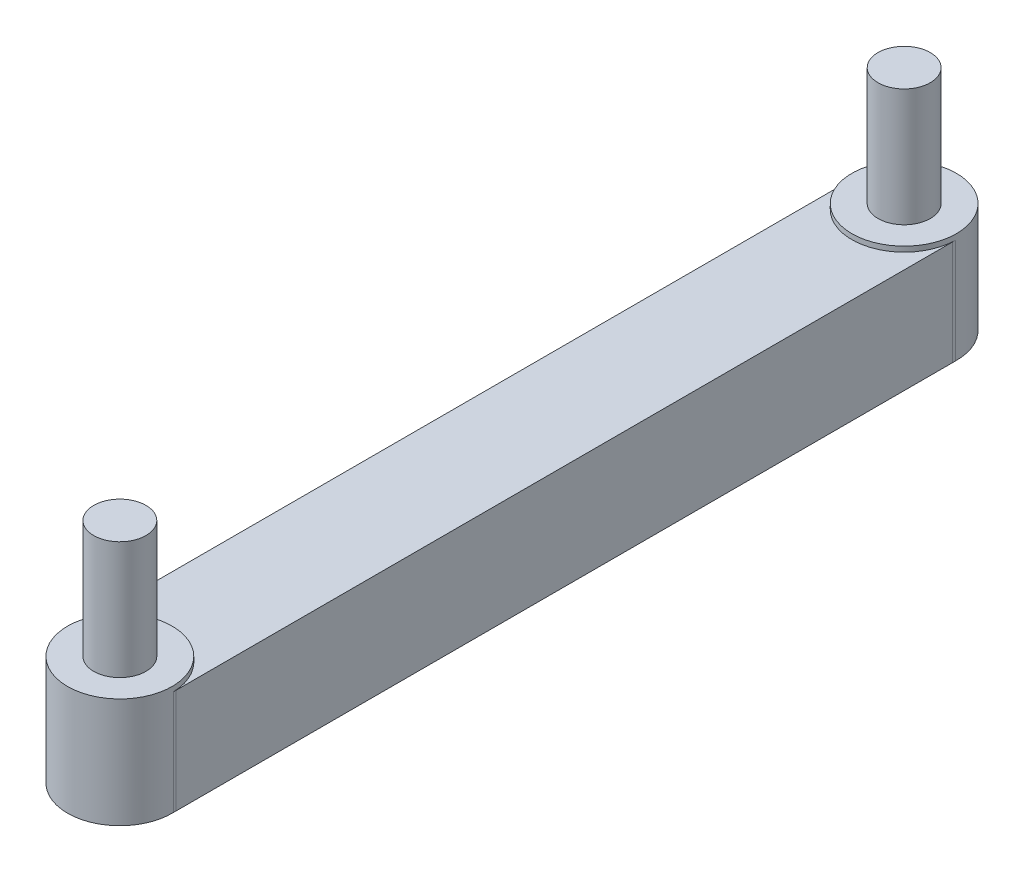
ISO-10303-21;
HEADER;
FILE_DESCRIPTION(('STEP AP214'),'2;1');
FILE_NAME('part.step','',(''),(''),'','','');
FILE_SCHEMA(('AUTOMOTIVE_DESIGN { 1 0 10303 214 1 1 1 1 }'));
ENDSEC;
DATA;
#1=APPLICATION_CONTEXT('core data for automotive mechanical design processes');
#2=APPLICATION_PROTOCOL_DEFINITION('international standard','automotive_design',2000,#1);
#3=PRODUCT_CONTEXT('',#1,'mechanical');
#4=PRODUCT('Part','Part','',(#3));
#5=PRODUCT_RELATED_PRODUCT_CATEGORY('part','',(#4));
#6=PRODUCT_DEFINITION_FORMATION('','',#4);
#7=PRODUCT_DEFINITION_CONTEXT('part definition',#1,'design');
#8=PRODUCT_DEFINITION('design','',#6,#7);
#9=PRODUCT_DEFINITION_SHAPE('','',#8);
#10=(LENGTH_UNIT() NAMED_UNIT(*) SI_UNIT(.MILLI.,.METRE.));
#11=(NAMED_UNIT(*) PLANE_ANGLE_UNIT() SI_UNIT($,.RADIAN.));
#12=(NAMED_UNIT(*) SI_UNIT($,.STERADIAN.) SOLID_ANGLE_UNIT());
#13=UNCERTAINTY_MEASURE_WITH_UNIT(LENGTH_MEASURE(1.E-05),#10,'distance_accuracy_value','');
#14=(GEOMETRIC_REPRESENTATION_CONTEXT(3) GLOBAL_UNCERTAINTY_ASSIGNED_CONTEXT((#13)) GLOBAL_UNIT_ASSIGNED_CONTEXT((#10,
#11,#12)) REPRESENTATION_CONTEXT('',''));
#15=CARTESIAN_POINT('',(0.,0.,0.));
#16=DIRECTION('',(0.,0.,1.));
#17=DIRECTION('',(1.,0.,0.));
#18=AXIS2_PLACEMENT_3D('',#15,#16,#17);
#19=CARTESIAN_POINT('',(2.,2.,29.7));
#20=DIRECTION('',(-1.,0.,0.));
#21=DIRECTION('',(0.,-1.,0.));
#22=AXIS2_PLACEMENT_3D('',#19,#20,#21);
#23=PLANE('',#22);
#24=DIRECTION('',(0.,1.,0.));
#25=VECTOR('',#24,1.);
#26=CARTESIAN_POINT('',(2.,2.,0.));
#27=LINE('',#26,#25);
#28=CARTESIAN_POINT('',(2.,-2.,0.));
#29=VERTEX_POINT('',#28);
#30=CARTESIAN_POINT('',(2.,2.,0.));
#31=VERTEX_POINT('',#30);
#32=EDGE_CURVE('E117',#29,#31,#27,.T.);
#33=ORIENTED_EDGE('',*,*,#32,.T.);
#34=DIRECTION('',(0.,0.,-1.));
#35=VECTOR('',#34,1.);
#36=CARTESIAN_POINT('',(2.,2.,29.7));
#37=LINE('',#36,#35);
#38=CARTESIAN_POINT('',(2.,2.,29.7));
#39=VERTEX_POINT('',#38);
#40=EDGE_CURVE('E101',#39,#31,#37,.T.);
#41=ORIENTED_EDGE('',*,*,#40,.F.);
#42=DIRECTION('',(0.,1.,0.));
#43=VECTOR('',#42,1.);
#44=CARTESIAN_POINT('',(2.,2.,29.7));
#45=LINE('',#44,#43);
#46=CARTESIAN_POINT('',(2.,-2.,29.7));
#47=VERTEX_POINT('',#46);
#48=EDGE_CURVE('E115',#47,#39,#45,.T.);
#49=ORIENTED_EDGE('',*,*,#48,.F.);
#50=DIRECTION('',(0.,0.,-1.));
#51=VECTOR('',#50,1.);
#52=CARTESIAN_POINT('',(2.,-2.,29.7));
#53=LINE('',#52,#51);
#54=EDGE_CURVE('E128',#47,#29,#53,.T.);
#55=ORIENTED_EDGE('',*,*,#54,.T.);
#56=EDGE_LOOP('',(#33,#41,#49,#55));
#57=FACE_BOUND('',#56,.T.);
#58=ADVANCED_FACE('F37',(#57),#23,.F.);
#59=CARTESIAN_POINT('',(-2.,2.,29.7));
#60=DIRECTION('',(0.,-1.,0.));
#61=DIRECTION('',(0.,0.,-1.));
#62=AXIS2_PLACEMENT_3D('',#59,#60,#61);
#63=PLANE('',#62);
#64=CARTESIAN_POINT('',(0.,2.,-0.149999999999999));
#65=DIRECTION('',(0.,-1.,0.));
#66=DIRECTION('',(0.,0.,-1.));
#67=AXIS2_PLACEMENT_3D('',#64,#65,#66);
#68=CIRCLE('',#67,2.);
#69=CARTESIAN_POINT('',(-1.99951736893376,2.,-0.106064919116807));
#70=VERTEX_POINT('',#69);
#71=CARTESIAN_POINT('',(1.99951736893376,2.,-0.106064919116807));
#72=VERTEX_POINT('',#71);
#73=EDGE_CURVE('E51',#70,#72,#68,.F.);
#74=ORIENTED_EDGE('',*,*,#73,.F.);
#75=CARTESIAN_POINT('',(-3.99903473786752,2.,-0.0621298382336141));
#76=DIRECTION('',(0.,-1.,0.));
#77=DIRECTION('',(0.,0.,-1.));
#78=AXIS2_PLACEMENT_3D('',#75,#76,#77);
#79=CIRCLE('',#78,2.);
#80=CARTESIAN_POINT('',(-2.,2.,0.));
#81=VERTEX_POINT('',#80);
#82=EDGE_CURVE('E109',#70,#81,#79,.T.);
#83=ORIENTED_EDGE('',*,*,#82,.T.);
#84=DIRECTION('',(0.,0.,-1.));
#85=VECTOR('',#84,1.);
#86=CARTESIAN_POINT('',(-2.,2.,29.7));
#87=LINE('',#86,#85);
#88=CARTESIAN_POINT('',(-2.,2.,29.7));
#89=VERTEX_POINT('',#88);
#90=EDGE_CURVE('E120',#89,#81,#87,.T.);
#91=ORIENTED_EDGE('',*,*,#90,.F.);
#92=CARTESIAN_POINT('',(-3.99903473786752,2.,29.7621298382335));
#93=DIRECTION('',(0.,-1.,0.));
#94=DIRECTION('',(0.,0.,-1.));
#95=AXIS2_PLACEMENT_3D('',#92,#93,#94);
#96=CIRCLE('',#95,2.);
#97=CARTESIAN_POINT('',(-1.99951736893376,2.,29.8060649191168));
#98=VERTEX_POINT('',#97);
#99=EDGE_CURVE('E150',#89,#98,#96,.T.);
#100=ORIENTED_EDGE('',*,*,#99,.T.);
#101=CARTESIAN_POINT('',(0.,2.,29.85));
#102=DIRECTION('',(0.,-1.,0.));
#103=DIRECTION('',(0.,0.,-1.));
#104=AXIS2_PLACEMENT_3D('',#101,#102,#103);
#105=CIRCLE('',#104,2.);
#106=CARTESIAN_POINT('',(1.99951736893376,2.,29.8060649191168));
#107=VERTEX_POINT('',#106);
#108=EDGE_CURVE('E104',#107,#98,#105,.F.);
#109=ORIENTED_EDGE('',*,*,#108,.F.);
#110=CARTESIAN_POINT('',(3.99903473786752,2.,29.7621298382335));
#111=DIRECTION('',(0.,-1.,0.));
#112=DIRECTION('',(0.,0.,-1.));
#113=AXIS2_PLACEMENT_3D('',#110,#111,#112);
#114=CIRCLE('',#113,2.);
#115=EDGE_CURVE('E98',#107,#39,#114,.T.);
#116=ORIENTED_EDGE('',*,*,#115,.T.);
#117=ORIENTED_EDGE('',*,*,#40,.T.);
#118=CARTESIAN_POINT('',(3.99903473786752,2.,-0.062129838233614));
#119=DIRECTION('',(0.,-1.,0.));
#120=DIRECTION('',(0.,0.,-1.));
#121=AXIS2_PLACEMENT_3D('',#118,#119,#120);
#122=CIRCLE('',#121,2.);
#123=EDGE_CURVE('E11',#31,#72,#122,.T.);
#124=ORIENTED_EDGE('',*,*,#123,.T.);
#125=EDGE_LOOP('',(#74,#83,#91,#100,#109,#116,#117,#124));
#126=FACE_BOUND('',#125,.T.);
#127=ADVANCED_FACE('F100',(#126),#63,.F.);
#128=CARTESIAN_POINT('',(-2.,2.,29.7));
#129=DIRECTION('',(1.,0.,0.));
#130=DIRECTION('',(0.,1.,0.));
#131=AXIS2_PLACEMENT_3D('',#128,#129,#130);
#132=PLANE('',#131);
#133=DIRECTION('',(0.,-1.,0.));
#134=VECTOR('',#133,1.);
#135=CARTESIAN_POINT('',(-2.,2.,0.));
#136=LINE('',#135,#134);
#137=CARTESIAN_POINT('',(-2.,-2.,0.));
#138=VERTEX_POINT('',#137);
#139=EDGE_CURVE('E125',#81,#138,#136,.T.);
#140=ORIENTED_EDGE('',*,*,#139,.T.);
#141=DIRECTION('',(0.,0.,-1.));
#142=VECTOR('',#141,1.);
#143=CARTESIAN_POINT('',(-2.,-2.,29.7));
#144=LINE('',#143,#142);
#145=CARTESIAN_POINT('',(-2.,-2.,29.7));
#146=VERTEX_POINT('',#145);
#147=EDGE_CURVE('E136',#146,#138,#144,.T.);
#148=ORIENTED_EDGE('',*,*,#147,.F.);
#149=DIRECTION('',(0.,-1.,0.));
#150=VECTOR('',#149,1.);
#151=CARTESIAN_POINT('',(-2.,2.,29.7));
#152=LINE('',#151,#150);
#153=EDGE_CURVE('E124',#89,#146,#152,.T.);
#154=ORIENTED_EDGE('',*,*,#153,.F.);
#155=ORIENTED_EDGE('',*,*,#90,.T.);
#156=EDGE_LOOP('',(#140,#148,#154,#155));
#157=FACE_BOUND('',#156,.T.);
#158=ADVANCED_FACE('F176',(#157),#132,.F.);
#159=CARTESIAN_POINT('',(-2.,-2.,29.7));
#160=DIRECTION('',(0.,1.,0.));
#161=DIRECTION('',(0.,0.,1.));
#162=AXIS2_PLACEMENT_3D('',#159,#160,#161);
#163=PLANE('',#162);
#164=ORIENTED_EDGE('',*,*,#147,.T.);
#165=CARTESIAN_POINT('',(-3.99903473786752,-2.,-0.0621298382336141));
#166=DIRECTION('',(0.,1.,0.));
#167=DIRECTION('',(0.,0.,1.));
#168=AXIS2_PLACEMENT_3D('',#165,#166,#167);
#169=CIRCLE('',#168,2.);
#170=CARTESIAN_POINT('',(-1.99951736893376,-2.,-0.106064919116807));
#171=VERTEX_POINT('',#170);
#172=EDGE_CURVE('E156',#138,#171,#169,.T.);
#173=ORIENTED_EDGE('',*,*,#172,.T.);
#174=CARTESIAN_POINT('',(0.,-2.,-0.149999999999999));
#175=DIRECTION('',(0.,1.,0.));
#176=DIRECTION('',(0.,0.,1.));
#177=AXIS2_PLACEMENT_3D('',#174,#175,#176);
#178=CIRCLE('',#177,2.);
#179=CARTESIAN_POINT('',(1.99951736893376,-2.,-0.106064919116807));
#180=VERTEX_POINT('',#179);
#181=EDGE_CURVE('E161',#180,#171,#178,.T.);
#182=ORIENTED_EDGE('',*,*,#181,.F.);
#183=CARTESIAN_POINT('',(3.99903473786752,-2.,-0.062129838233614));
#184=DIRECTION('',(0.,1.,0.));
#185=DIRECTION('',(0.,0.,1.));
#186=AXIS2_PLACEMENT_3D('',#183,#184,#185);
#187=CIRCLE('',#186,2.);
#188=EDGE_CURVE('E45',#180,#29,#187,.T.);
#189=ORIENTED_EDGE('',*,*,#188,.T.);
#190=ORIENTED_EDGE('',*,*,#54,.F.);
#191=CARTESIAN_POINT('',(3.99903473786752,-2.,29.7621298382335));
#192=DIRECTION('',(0.,1.,0.));
#193=DIRECTION('',(0.,0.,1.));
#194=AXIS2_PLACEMENT_3D('',#191,#192,#193);
#195=CIRCLE('',#194,2.);
#196=CARTESIAN_POINT('',(1.99951736893376,-2.,29.8060649191168));
#197=VERTEX_POINT('',#196);
#198=EDGE_CURVE('E110',#47,#197,#195,.T.);
#199=ORIENTED_EDGE('',*,*,#198,.T.);
#200=CARTESIAN_POINT('',(0.,-2.,29.85));
#201=DIRECTION('',(0.,1.,0.));
#202=DIRECTION('',(0.,0.,1.));
#203=AXIS2_PLACEMENT_3D('',#200,#201,#202);
#204=CIRCLE('',#203,2.);
#205=CARTESIAN_POINT('',(-1.99951736893376,-2.,29.8060649191168));
#206=VERTEX_POINT('',#205);
#207=EDGE_CURVE('E187',#206,#197,#204,.T.);
#208=ORIENTED_EDGE('',*,*,#207,.F.);
#209=CARTESIAN_POINT('',(-3.99903473786752,-2.,29.7621298382335));
#210=DIRECTION('',(0.,1.,0.));
#211=DIRECTION('',(0.,0.,1.));
#212=AXIS2_PLACEMENT_3D('',#209,#210,#211);
#213=CIRCLE('',#212,2.);
#214=EDGE_CURVE('E152',#206,#146,#213,.T.);
#215=ORIENTED_EDGE('',*,*,#214,.T.);
#216=EDGE_LOOP('',(#164,#173,#182,#189,#190,#199,#208,#215));
#217=FACE_BOUND('',#216,.T.);
#218=ADVANCED_FACE('F159',(#217),#163,.F.);
#219=CARTESIAN_POINT('',(0.,2.2,29.85));
#220=DIRECTION('',(0.,-1.,0.));
#221=DIRECTION('',(0.,0.,-1.));
#222=AXIS2_PLACEMENT_3D('',#219,#220,#221);
#223=CYLINDRICAL_SURFACE('',#222,2.);
#224=ORIENTED_EDGE('',*,*,#108,.T.);
#225=DIRECTION('',(0.,-1.,0.));
#226=VECTOR('',#225,1.);
#227=CARTESIAN_POINT('',(-1.99951736893376,2.2,29.8060649191168));
#228=LINE('',#227,#226);
#229=EDGE_CURVE('E143',#98,#206,#228,.T.);
#230=ORIENTED_EDGE('',*,*,#229,.T.);
#231=ORIENTED_EDGE('',*,*,#207,.T.);
#232=DIRECTION('',(0.,-1.,0.));
#233=VECTOR('',#232,1.);
#234=CARTESIAN_POINT('',(1.99951736893376,2.2,29.8060649191168));
#235=LINE('',#234,#233);
#236=EDGE_CURVE('E141',#197,#107,#235,.F.);
#237=ORIENTED_EDGE('',*,*,#236,.T.);
#238=EDGE_LOOP('',(#224,#230,#231,#237));
#239=FACE_BOUND('',#238,.T.);
#240=CARTESIAN_POINT('',(0.,2.2,29.85));
#241=DIRECTION('',(0.,1.,0.));
#242=DIRECTION('',(0.,0.,1.));
#243=AXIS2_PLACEMENT_3D('',#240,#241,#242);
#244=CIRCLE('',#243,2.);
#245=CARTESIAN_POINT('',(0.,2.2,31.85));
#246=VERTEX_POINT('',#245);
#247=EDGE_CURVE('E188',#246,#246,#244,.T.);
#248=ORIENTED_EDGE('',*,*,#247,.F.);
#249=EDGE_LOOP('',(#248));
#250=FACE_BOUND('',#249,.T.);
#251=ADVANCED_FACE('F185',(#239,#250),#223,.T.);
#252=CARTESIAN_POINT('',(0.,2.2,29.85));
#253=DIRECTION('',(0.,1.,0.));
#254=DIRECTION('',(0.,0.,1.));
#255=AXIS2_PLACEMENT_3D('',#252,#253,#254);
#256=PLANE('',#255);
#257=CARTESIAN_POINT('',(0.,2.2,29.85));
#258=DIRECTION('',(0.,1.,0.));
#259=DIRECTION('',(0.,0.,1.));
#260=AXIS2_PLACEMENT_3D('',#257,#258,#259);
#261=CIRCLE('',#260,1.);
#262=CARTESIAN_POINT('',(0.,2.2,30.85));
#263=VERTEX_POINT('',#262);
#264=EDGE_CURVE('E119',#263,#263,#261,.T.);
#265=ORIENTED_EDGE('',*,*,#264,.F.);
#266=EDGE_LOOP('',(#265));
#267=FACE_BOUND('',#266,.T.);
#268=ORIENTED_EDGE('',*,*,#247,.T.);
#269=EDGE_LOOP('',(#268));
#270=FACE_BOUND('',#269,.T.);
#271=ADVANCED_FACE('F222',(#267,#270),#256,.T.);
#272=CARTESIAN_POINT('',(0.,2.2,-0.149999999999999));
#273=DIRECTION('',(0.,-1.,0.));
#274=DIRECTION('',(0.,0.,-1.));
#275=AXIS2_PLACEMENT_3D('',#272,#273,#274);
#276=CYLINDRICAL_SURFACE('',#275,2.);
#277=CARTESIAN_POINT('',(0.,2.2,-0.149999999999999));
#278=DIRECTION('',(0.,1.,0.));
#279=DIRECTION('',(0.,0.,1.));
#280=AXIS2_PLACEMENT_3D('',#277,#278,#279);
#281=CIRCLE('',#280,2.);
#282=CARTESIAN_POINT('',(0.,2.2,1.85));
#283=VERTEX_POINT('',#282);
#284=EDGE_CURVE('E166',#283,#283,#281,.T.);
#285=ORIENTED_EDGE('',*,*,#284,.F.);
#286=EDGE_LOOP('',(#285));
#287=FACE_BOUND('',#286,.T.);
#288=ORIENTED_EDGE('',*,*,#181,.T.);
#289=DIRECTION('',(0.,-1.,0.));
#290=VECTOR('',#289,1.);
#291=CARTESIAN_POINT('',(-1.99951736893376,2.2,-0.106064919116807));
#292=LINE('',#291,#290);
#293=EDGE_CURVE('E148',#171,#70,#292,.F.);
#294=ORIENTED_EDGE('',*,*,#293,.T.);
#295=ORIENTED_EDGE('',*,*,#73,.T.);
#296=DIRECTION('',(0.,-1.,0.));
#297=VECTOR('',#296,1.);
#298=CARTESIAN_POINT('',(1.99951736893376,2.2,-0.106064919116807));
#299=LINE('',#298,#297);
#300=EDGE_CURVE('E146',#72,#180,#299,.T.);
#301=ORIENTED_EDGE('',*,*,#300,.T.);
#302=EDGE_LOOP('',(#288,#294,#295,#301));
#303=FACE_BOUND('',#302,.T.);
#304=ADVANCED_FACE('F164',(#287,#303),#276,.T.);
#305=CARTESIAN_POINT('',(0.,2.2,-0.149999999999999));
#306=DIRECTION('',(0.,1.,0.));
#307=DIRECTION('',(0.,0.,1.));
#308=AXIS2_PLACEMENT_3D('',#305,#306,#307);
#309=PLANE('',#308);
#310=CARTESIAN_POINT('',(0.,2.2,-0.149999999999999));
#311=DIRECTION('',(0.,1.,0.));
#312=DIRECTION('',(0.,0.,1.));
#313=AXIS2_PLACEMENT_3D('',#310,#311,#312);
#314=CIRCLE('',#313,1.);
#315=CARTESIAN_POINT('',(0.,2.2,0.850000000000001));
#316=VERTEX_POINT('',#315);
#317=EDGE_CURVE('E144',#316,#316,#314,.T.);
#318=ORIENTED_EDGE('',*,*,#317,.F.);
#319=EDGE_LOOP('',(#318));
#320=FACE_BOUND('',#319,.T.);
#321=ORIENTED_EDGE('',*,*,#284,.T.);
#322=EDGE_LOOP('',(#321));
#323=FACE_BOUND('',#322,.T.);
#324=ADVANCED_FACE('F214',(#320,#323),#309,.T.);
#325=CARTESIAN_POINT('',(0.,6.7,29.85));
#326=DIRECTION('',(0.,-1.,0.));
#327=DIRECTION('',(0.,0.,-1.));
#328=AXIS2_PLACEMENT_3D('',#325,#326,#327);
#329=CYLINDRICAL_SURFACE('',#328,1.);
#330=CARTESIAN_POINT('',(0.,6.7,29.85));
#331=DIRECTION('',(0.,1.,0.));
#332=DIRECTION('',(0.,0.,1.));
#333=AXIS2_PLACEMENT_3D('',#330,#331,#332);
#334=CIRCLE('',#333,1.);
#335=CARTESIAN_POINT('',(0.,6.7,30.85));
#336=VERTEX_POINT('',#335);
#337=EDGE_CURVE('E167',#336,#336,#334,.T.);
#338=ORIENTED_EDGE('',*,*,#337,.F.);
#339=EDGE_LOOP('',(#338));
#340=FACE_BOUND('',#339,.T.);
#341=ORIENTED_EDGE('',*,*,#264,.T.);
#342=EDGE_LOOP('',(#341));
#343=FACE_BOUND('',#342,.T.);
#344=ADVANCED_FACE('F217',(#340,#343),#329,.T.);
#345=CARTESIAN_POINT('',(0.,6.7,29.85));
#346=DIRECTION('',(0.,1.,0.));
#347=DIRECTION('',(0.,0.,1.));
#348=AXIS2_PLACEMENT_3D('',#345,#346,#347);
#349=PLANE('',#348);
#350=ORIENTED_EDGE('',*,*,#337,.T.);
#351=EDGE_LOOP('',(#350));
#352=FACE_BOUND('',#351,.T.);
#353=ADVANCED_FACE('F210',(#352),#349,.T.);
#354=CARTESIAN_POINT('',(0.,6.7,-0.149999999999999));
#355=DIRECTION('',(0.,-1.,0.));
#356=DIRECTION('',(0.,0.,-1.));
#357=AXIS2_PLACEMENT_3D('',#354,#355,#356);
#358=CYLINDRICAL_SURFACE('',#357,1.);
#359=CARTESIAN_POINT('',(0.,6.7,-0.149999999999999));
#360=DIRECTION('',(0.,1.,0.));
#361=DIRECTION('',(0.,0.,1.));
#362=AXIS2_PLACEMENT_3D('',#359,#360,#361);
#363=CIRCLE('',#362,1.);
#364=CARTESIAN_POINT('',(0.,6.7,0.850000000000001));
#365=VERTEX_POINT('',#364);
#366=EDGE_CURVE('E199',#365,#365,#363,.T.);
#367=ORIENTED_EDGE('',*,*,#366,.F.);
#368=EDGE_LOOP('',(#367));
#369=FACE_BOUND('',#368,.T.);
#370=ORIENTED_EDGE('',*,*,#317,.T.);
#371=EDGE_LOOP('',(#370));
#372=FACE_BOUND('',#371,.T.);
#373=ADVANCED_FACE('F207',(#369,#372),#358,.T.);
#374=CARTESIAN_POINT('',(0.,6.7,-0.149999999999999));
#375=DIRECTION('',(0.,1.,0.));
#376=DIRECTION('',(0.,0.,1.));
#377=AXIS2_PLACEMENT_3D('',#374,#375,#376);
#378=PLANE('',#377);
#379=ORIENTED_EDGE('',*,*,#366,.T.);
#380=EDGE_LOOP('',(#379));
#381=FACE_BOUND('',#380,.T.);
#382=ADVANCED_FACE('F205',(#381),#378,.T.);
#383=CARTESIAN_POINT('',(-3.99903473786752,2.2,29.7621298382335));
#384=DIRECTION('',(0.,-1.,0.));
#385=DIRECTION('',(1.,0.,0.));
#386=AXIS2_PLACEMENT_3D('',#383,#384,#385);
#387=CYLINDRICAL_SURFACE('',#386,2.);
#388=ORIENTED_EDGE('',*,*,#214,.F.);
#389=ORIENTED_EDGE('',*,*,#229,.F.);
#390=ORIENTED_EDGE('',*,*,#99,.F.);
#391=ORIENTED_EDGE('',*,*,#153,.T.);
#392=EDGE_LOOP('',(#388,#389,#390,#391));
#393=FACE_BOUND('',#392,.T.);
#394=ADVANCED_FACE('F180',(#393),#387,.F.);
#395=CARTESIAN_POINT('',(3.99903473786752,2.2,29.7621298382335));
#396=DIRECTION('',(0.,1.,0.));
#397=DIRECTION('',(-1.,0.,0.));
#398=AXIS2_PLACEMENT_3D('',#395,#396,#397);
#399=CYLINDRICAL_SURFACE('',#398,2.);
#400=ORIENTED_EDGE('',*,*,#115,.F.);
#401=ORIENTED_EDGE('',*,*,#236,.F.);
#402=ORIENTED_EDGE('',*,*,#198,.F.);
#403=ORIENTED_EDGE('',*,*,#48,.T.);
#404=EDGE_LOOP('',(#400,#401,#402,#403));
#405=FACE_BOUND('',#404,.T.);
#406=ADVANCED_FACE('F122',(#405),#399,.F.);
#407=CARTESIAN_POINT('',(-3.99903473786752,0.,-0.0621298382336141));
#408=DIRECTION('',(0.,-1.,0.));
#409=DIRECTION('',(0.,0.,-1.));
#410=AXIS2_PLACEMENT_3D('',#407,#408,#409);
#411=CYLINDRICAL_SURFACE('',#410,2.);
#412=ORIENTED_EDGE('',*,*,#172,.F.);
#413=ORIENTED_EDGE('',*,*,#139,.F.);
#414=ORIENTED_EDGE('',*,*,#82,.F.);
#415=ORIENTED_EDGE('',*,*,#293,.F.);
#416=EDGE_LOOP('',(#412,#413,#414,#415));
#417=FACE_BOUND('',#416,.T.);
#418=ADVANCED_FACE('F171',(#417),#411,.F.);
#419=CARTESIAN_POINT('',(3.99903473786752,0.,-0.062129838233614));
#420=DIRECTION('',(0.,1.,0.));
#421=DIRECTION('',(0.,0.,1.));
#422=AXIS2_PLACEMENT_3D('',#419,#420,#421);
#423=CYLINDRICAL_SURFACE('',#422,2.);
#424=ORIENTED_EDGE('',*,*,#123,.F.);
#425=ORIENTED_EDGE('',*,*,#32,.F.);
#426=ORIENTED_EDGE('',*,*,#188,.F.);
#427=ORIENTED_EDGE('',*,*,#300,.F.);
#428=EDGE_LOOP('',(#424,#425,#426,#427));
#429=FACE_BOUND('',#428,.T.);
#430=ADVANCED_FACE('F39',(#429),#423,.F.);
#431=CLOSED_SHELL('',(#58,#127,#158,#218,#251,#271,#304,#324,#344,#353,#373,#382,#394,#406,#418,#430));
#432=MANIFOLD_SOLID_BREP('B2',#431);
#433=ADVANCED_BREP_SHAPE_REPRESENTATION('',(#18,#432),#14);
#434=SHAPE_DEFINITION_REPRESENTATION(#9,#433);
ENDSEC;
END-ISO-10303-21;
